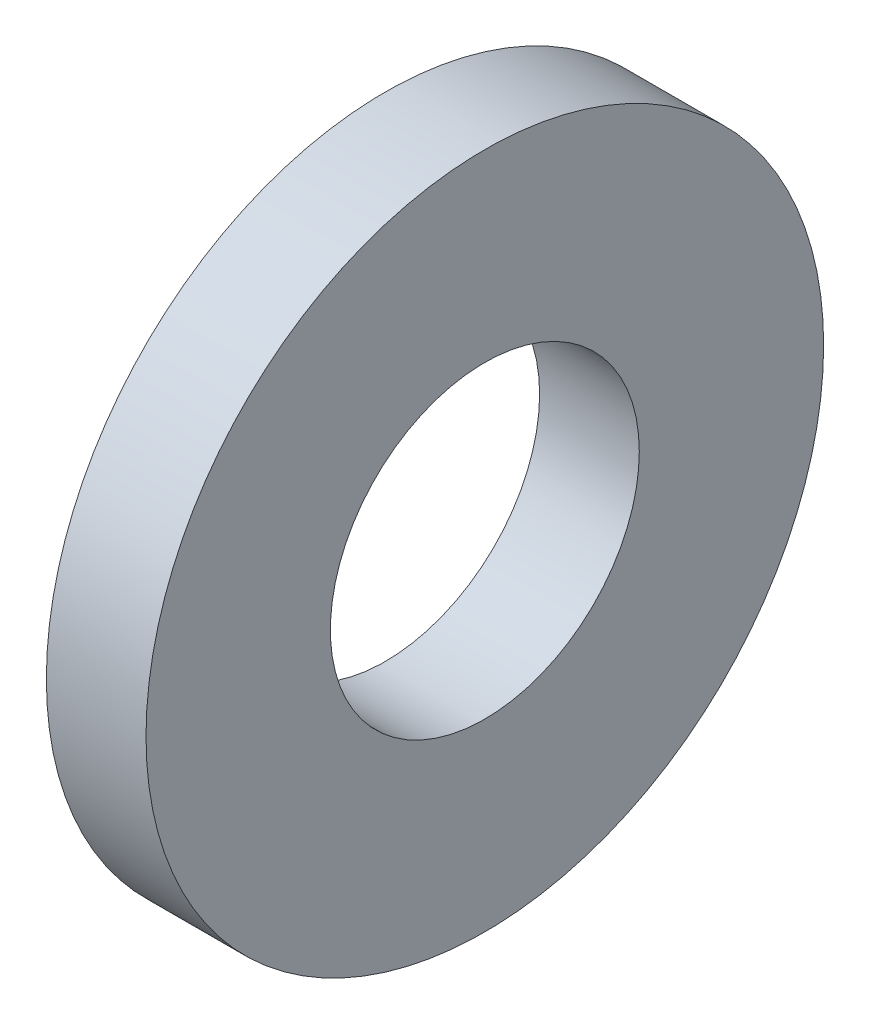
ISO-10303-21;
HEADER;
FILE_DESCRIPTION(('STEP AP214'),'2;1');
FILE_NAME('part.step','',(''),(''),'','','');
FILE_SCHEMA(('AUTOMOTIVE_DESIGN { 1 0 10303 214 1 1 1 1 }'));
ENDSEC;
DATA;
#1=APPLICATION_CONTEXT('core data for automotive mechanical design processes');
#2=APPLICATION_PROTOCOL_DEFINITION('international standard','automotive_design',2000,#1);
#3=PRODUCT_CONTEXT('',#1,'mechanical');
#4=PRODUCT('Part','Part','',(#3));
#5=PRODUCT_RELATED_PRODUCT_CATEGORY('part','',(#4));
#6=PRODUCT_DEFINITION_FORMATION('','',#4);
#7=PRODUCT_DEFINITION_CONTEXT('part definition',#1,'design');
#8=PRODUCT_DEFINITION('design','',#6,#7);
#9=PRODUCT_DEFINITION_SHAPE('','',#8);
#10=(LENGTH_UNIT() NAMED_UNIT(*) SI_UNIT(.MILLI.,.METRE.));
#11=(NAMED_UNIT(*) PLANE_ANGLE_UNIT() SI_UNIT($,.RADIAN.));
#12=(NAMED_UNIT(*) SI_UNIT($,.STERADIAN.) SOLID_ANGLE_UNIT());
#13=UNCERTAINTY_MEASURE_WITH_UNIT(LENGTH_MEASURE(1.E-05),#10,'distance_accuracy_value','');
#14=(GEOMETRIC_REPRESENTATION_CONTEXT(3) GLOBAL_UNCERTAINTY_ASSIGNED_CONTEXT((#13)) GLOBAL_UNIT_ASSIGNED_CONTEXT((#10,
#11,#12)) REPRESENTATION_CONTEXT('',''));
#15=CARTESIAN_POINT('',(0.,0.,0.));
#16=DIRECTION('',(0.,0.,1.));
#17=DIRECTION('',(1.,0.,0.));
#18=AXIS2_PLACEMENT_3D('',#15,#16,#17);
#19=CARTESIAN_POINT('',(10.,0.,0.));
#20=DIRECTION('',(1.,0.,0.));
#21=DIRECTION('',(0.,0.,-1.));
#22=AXIS2_PLACEMENT_3D('',#19,#20,#21);
#23=PLANE('',#22);
#24=CARTESIAN_POINT('',(10.,0.,0.));
#25=DIRECTION('',(1.,0.,0.));
#26=DIRECTION('',(0.,0.,-1.));
#27=AXIS2_PLACEMENT_3D('',#24,#25,#26);
#28=CIRCLE('',#27,34.);
#29=CARTESIAN_POINT('',(10.,0.,-34.));
#30=VERTEX_POINT('',#29);
#31=EDGE_CURVE('E10',#30,#30,#28,.T.);
#32=ORIENTED_EDGE('',*,*,#31,.T.);
#33=EDGE_LOOP('',(#32));
#34=FACE_BOUND('',#33,.T.);
#35=CARTESIAN_POINT('',(10.,0.,0.));
#36=DIRECTION('',(1.,0.,0.));
#37=DIRECTION('',(0.,0.,-1.));
#38=AXIS2_PLACEMENT_3D('',#35,#36,#37);
#39=CIRCLE('',#38,15.5);
#40=CARTESIAN_POINT('',(10.,0.,-15.5));
#41=VERTEX_POINT('',#40);
#42=EDGE_CURVE('E41',#41,#41,#39,.T.);
#43=ORIENTED_EDGE('',*,*,#42,.F.);
#44=EDGE_LOOP('',(#43));
#45=FACE_BOUND('',#44,.T.);
#46=ADVANCED_FACE('F30',(#34,#45),#23,.T.);
#47=CARTESIAN_POINT('',(0.,0.,0.));
#48=DIRECTION('',(1.,0.,0.));
#49=DIRECTION('',(0.,0.,-1.));
#50=AXIS2_PLACEMENT_3D('',#47,#48,#49);
#51=PLANE('',#50);
#52=CARTESIAN_POINT('',(0.,0.,0.));
#53=DIRECTION('',(1.,0.,0.));
#54=DIRECTION('',(0.,0.,-1.));
#55=AXIS2_PLACEMENT_3D('',#52,#53,#54);
#56=CIRCLE('',#55,34.);
#57=CARTESIAN_POINT('',(0.,0.,-34.));
#58=VERTEX_POINT('',#57);
#59=EDGE_CURVE('E34',#58,#58,#56,.T.);
#60=ORIENTED_EDGE('',*,*,#59,.F.);
#61=EDGE_LOOP('',(#60));
#62=FACE_BOUND('',#61,.T.);
#63=CARTESIAN_POINT('',(0.,0.,0.));
#64=DIRECTION('',(1.,0.,0.));
#65=DIRECTION('',(0.,0.,-1.));
#66=AXIS2_PLACEMENT_3D('',#63,#64,#65);
#67=CIRCLE('',#66,15.5);
#68=CARTESIAN_POINT('',(0.,0.,-15.5));
#69=VERTEX_POINT('',#68);
#70=EDGE_CURVE('E43',#69,#69,#67,.T.);
#71=ORIENTED_EDGE('',*,*,#70,.T.);
#72=EDGE_LOOP('',(#71));
#73=FACE_BOUND('',#72,.T.);
#74=ADVANCED_FACE('F53',(#62,#73),#51,.F.);
#75=CARTESIAN_POINT('',(10.,0.,0.));
#76=DIRECTION('',(-1.,0.,0.));
#77=DIRECTION('',(0.,0.,1.));
#78=AXIS2_PLACEMENT_3D('',#75,#76,#77);
#79=CYLINDRICAL_SURFACE('',#78,34.);
#80=ORIENTED_EDGE('',*,*,#31,.F.);
#81=EDGE_LOOP('',(#80));
#82=FACE_BOUND('',#81,.T.);
#83=ORIENTED_EDGE('',*,*,#59,.T.);
#84=EDGE_LOOP('',(#83));
#85=FACE_BOUND('',#84,.T.);
#86=ADVANCED_FACE('F32',(#82,#85),#79,.T.);
#87=CARTESIAN_POINT('',(10.,0.,0.));
#88=DIRECTION('',(-1.,0.,0.));
#89=DIRECTION('',(0.,0.,1.));
#90=AXIS2_PLACEMENT_3D('',#87,#88,#89);
#91=CYLINDRICAL_SURFACE('',#90,15.5);
#92=ORIENTED_EDGE('',*,*,#42,.T.);
#93=EDGE_LOOP('',(#92));
#94=FACE_BOUND('',#93,.T.);
#95=ORIENTED_EDGE('',*,*,#70,.F.);
#96=EDGE_LOOP('',(#95));
#97=FACE_BOUND('',#96,.T.);
#98=ADVANCED_FACE('F49',(#94,#97),#91,.F.);
#99=CLOSED_SHELL('',(#46,#74,#86,#98));
#100=MANIFOLD_SOLID_BREP('B2',#99);
#101=ADVANCED_BREP_SHAPE_REPRESENTATION('',(#18,#100),#14);
#102=SHAPE_DEFINITION_REPRESENTATION(#9,#101);
ENDSEC;
END-ISO-10303-21;
